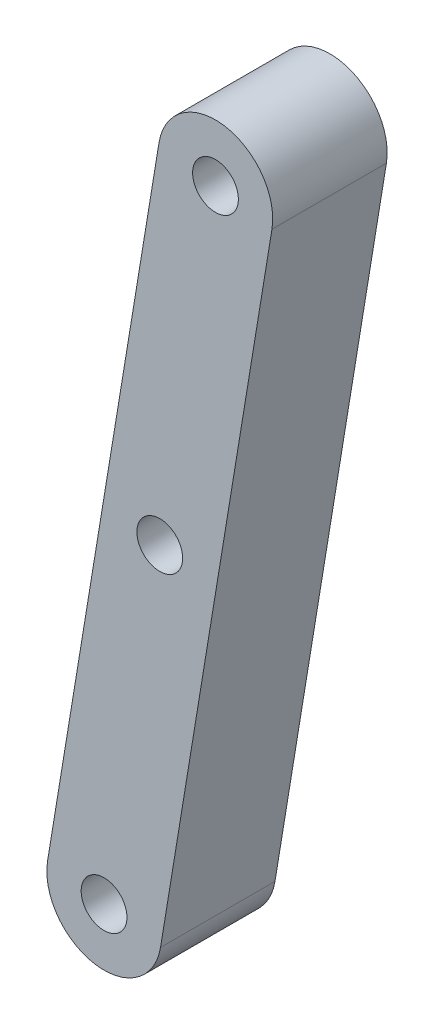
ISO-10303-21;
HEADER;
FILE_DESCRIPTION(('STEP AP214'),'2;1');
FILE_NAME('part.step','',(''),(''),'','','');
FILE_SCHEMA(('AUTOMOTIVE_DESIGN { 1 0 10303 214 1 1 1 1 }'));
ENDSEC;
DATA;
#1=APPLICATION_CONTEXT('core data for automotive mechanical design processes');
#2=APPLICATION_PROTOCOL_DEFINITION('international standard','automotive_design',2000,#1);
#3=PRODUCT_CONTEXT('',#1,'mechanical');
#4=PRODUCT('Part','Part','',(#3));
#5=PRODUCT_RELATED_PRODUCT_CATEGORY('part','',(#4));
#6=PRODUCT_DEFINITION_FORMATION('','',#4);
#7=PRODUCT_DEFINITION_CONTEXT('part definition',#1,'design');
#8=PRODUCT_DEFINITION('design','',#6,#7);
#9=PRODUCT_DEFINITION_SHAPE('','',#8);
#10=(LENGTH_UNIT() NAMED_UNIT(*) SI_UNIT(.MILLI.,.METRE.));
#11=(NAMED_UNIT(*) PLANE_ANGLE_UNIT() SI_UNIT($,.RADIAN.));
#12=(NAMED_UNIT(*) SI_UNIT($,.STERADIAN.) SOLID_ANGLE_UNIT());
#13=UNCERTAINTY_MEASURE_WITH_UNIT(LENGTH_MEASURE(1.E-05),#10,'distance_accuracy_value','');
#14=(GEOMETRIC_REPRESENTATION_CONTEXT(3) GLOBAL_UNCERTAINTY_ASSIGNED_CONTEXT((#13)) GLOBAL_UNIT_ASSIGNED_CONTEXT((#10,
#11,#12)) REPRESENTATION_CONTEXT('',''));
#15=CARTESIAN_POINT('',(0.,0.,0.));
#16=DIRECTION('',(0.,0.,1.));
#17=DIRECTION('',(1.,0.,0.));
#18=AXIS2_PLACEMENT_3D('',#15,#16,#17);
#19=CARTESIAN_POINT('',(-0.265703813634478,19.205096721111,10.));
#20=DIRECTION('',(0.,0.,1.));
#21=DIRECTION('',(1.,0.,0.));
#22=AXIS2_PLACEMENT_3D('',#19,#20,#21);
#23=PLANE('',#22);
#24=CARTESIAN_POINT('',(-5.13285190681724,-10.3974516394445,10.));
#25=DIRECTION('',(0.,0.,1.));
#26=DIRECTION('',(1.,0.,0.));
#27=AXIS2_PLACEMENT_3D('',#24,#25,#26);
#28=CIRCLE('',#27,2.);
#29=CARTESIAN_POINT('',(-3.13285190681724,-10.3974516394445,10.));
#30=VERTEX_POINT('',#29);
#31=EDGE_CURVE('E118',#30,#30,#28,.T.);
#32=ORIENTED_EDGE('',*,*,#31,.F.);
#33=EDGE_LOOP('',(#32));
#34=FACE_BOUND('',#33,.T.);
#35=CARTESIAN_POINT('',(-0.265703813634478,19.205096721111,10.));
#36=DIRECTION('',(0.,0.,1.));
#37=DIRECTION('',(1.,0.,0.));
#38=AXIS2_PLACEMENT_3D('',#35,#36,#37);
#39=CIRCLE('',#38,5.);
#40=CARTESIAN_POINT('',(4.66805424645811,18.3939053722472,10.));
#41=VERTEX_POINT('',#40);
#42=CARTESIAN_POINT('',(-5.19946187372706,20.0162880699748,10.));
#43=VERTEX_POINT('',#42);
#44=EDGE_CURVE('E88',#41,#43,#39,.T.);
#45=ORIENTED_EDGE('',*,*,#44,.T.);
#46=DIRECTION('',(-0.162238269772759,-0.986751612018517,0.));
#47=VECTOR('',#46,1.);
#48=CARTESIAN_POINT('',(-5.19946187372706,20.0162880699748,10.));
#49=LINE('',#48,#47);
#50=CARTESIAN_POINT('',(-14.9337580600926,-39.1888086511362,10.));
#51=VERTEX_POINT('',#50);
#52=EDGE_CURVE('E83',#43,#51,#49,.T.);
#53=ORIENTED_EDGE('',*,*,#52,.T.);
#54=CARTESIAN_POINT('',(-10.,-40.,10.));
#55=DIRECTION('',(0.,0.,1.));
#56=DIRECTION('',(1.,0.,0.));
#57=AXIS2_PLACEMENT_3D('',#54,#55,#56);
#58=CIRCLE('',#57,5.);
#59=CARTESIAN_POINT('',(-5.06624193990742,-40.8111913488638,10.));
#60=VERTEX_POINT('',#59);
#61=EDGE_CURVE('E86',#51,#60,#58,.T.);
#62=ORIENTED_EDGE('',*,*,#61,.T.);
#63=DIRECTION('',(0.162238269772759,0.986751612018517,0.));
#64=VECTOR('',#63,1.);
#65=CARTESIAN_POINT('',(-5.06624193990742,-40.8111913488638,10.));
#66=LINE('',#65,#64);
#67=EDGE_CURVE('E53',#60,#41,#66,.T.);
#68=ORIENTED_EDGE('',*,*,#67,.T.);
#69=EDGE_LOOP('',(#45,#53,#62,#68));
#70=FACE_BOUND('',#69,.T.);
#71=CARTESIAN_POINT('',(-10.,-40.,10.));
#72=DIRECTION('',(0.,0.,1.));
#73=DIRECTION('',(1.,0.,0.));
#74=AXIS2_PLACEMENT_3D('',#71,#72,#73);
#75=CIRCLE('',#74,2.);
#76=CARTESIAN_POINT('',(-8.,-40.,10.));
#77=VERTEX_POINT('',#76);
#78=EDGE_CURVE('E103',#77,#77,#75,.T.);
#79=ORIENTED_EDGE('',*,*,#78,.F.);
#80=EDGE_LOOP('',(#79));
#81=FACE_BOUND('',#80,.T.);
#82=CARTESIAN_POINT('',(-0.265703813634478,19.205096721111,10.));
#83=DIRECTION('',(0.,0.,1.));
#84=DIRECTION('',(1.,0.,0.));
#85=AXIS2_PLACEMENT_3D('',#82,#83,#84);
#86=CIRCLE('',#85,2.);
#87=CARTESIAN_POINT('',(1.73429618636552,19.205096721111,10.));
#88=VERTEX_POINT('',#87);
#89=EDGE_CURVE('E124',#88,#88,#86,.T.);
#90=ORIENTED_EDGE('',*,*,#89,.F.);
#91=EDGE_LOOP('',(#90));
#92=FACE_BOUND('',#91,.T.);
#93=ADVANCED_FACE('F36',(#34,#70,#81,#92),#23,.T.);
#94=CARTESIAN_POINT('',(-0.265703813634478,19.205096721111,0.));
#95=DIRECTION('',(0.,0.,1.));
#96=DIRECTION('',(1.,0.,0.));
#97=AXIS2_PLACEMENT_3D('',#94,#95,#96);
#98=PLANE('',#97);
#99=CARTESIAN_POINT('',(-0.265703813634478,19.205096721111,0.));
#100=DIRECTION('',(0.,0.,1.));
#101=DIRECTION('',(1.,0.,0.));
#102=AXIS2_PLACEMENT_3D('',#99,#100,#101);
#103=CIRCLE('',#102,5.);
#104=CARTESIAN_POINT('',(4.66805424645811,18.3939053722472,0.));
#105=VERTEX_POINT('',#104);
#106=CARTESIAN_POINT('',(-5.19946187372706,20.0162880699748,0.));
#107=VERTEX_POINT('',#106);
#108=EDGE_CURVE('E100',#105,#107,#103,.T.);
#109=ORIENTED_EDGE('',*,*,#108,.F.);
#110=DIRECTION('',(0.162238269772759,0.986751612018517,0.));
#111=VECTOR('',#110,1.);
#112=CARTESIAN_POINT('',(-5.06624193990742,-40.8111913488638,0.));
#113=LINE('',#112,#111);
#114=CARTESIAN_POINT('',(-5.06624193990742,-40.8111913488638,0.));
#115=VERTEX_POINT('',#114);
#116=EDGE_CURVE('E76',#115,#105,#113,.T.);
#117=ORIENTED_EDGE('',*,*,#116,.F.);
#118=CARTESIAN_POINT('',(-10.,-40.,0.));
#119=DIRECTION('',(0.,0.,1.));
#120=DIRECTION('',(1.,0.,0.));
#121=AXIS2_PLACEMENT_3D('',#118,#119,#120);
#122=CIRCLE('',#121,5.);
#123=CARTESIAN_POINT('',(-14.9337580600926,-39.1888086511362,0.));
#124=VERTEX_POINT('',#123);
#125=EDGE_CURVE('E70',#124,#115,#122,.T.);
#126=ORIENTED_EDGE('',*,*,#125,.F.);
#127=DIRECTION('',(-0.162238269772759,-0.986751612018517,0.));
#128=VECTOR('',#127,1.);
#129=CARTESIAN_POINT('',(-5.19946187372706,20.0162880699748,0.));
#130=LINE('',#129,#128);
#131=EDGE_CURVE('E92',#107,#124,#130,.T.);
#132=ORIENTED_EDGE('',*,*,#131,.F.);
#133=EDGE_LOOP('',(#109,#117,#126,#132));
#134=FACE_BOUND('',#133,.T.);
#135=CARTESIAN_POINT('',(-10.,-40.,0.));
#136=DIRECTION('',(0.,0.,1.));
#137=DIRECTION('',(1.,0.,0.));
#138=AXIS2_PLACEMENT_3D('',#135,#136,#137);
#139=CIRCLE('',#138,2.);
#140=CARTESIAN_POINT('',(-8.,-40.,0.));
#141=VERTEX_POINT('',#140);
#142=EDGE_CURVE('E115',#141,#141,#139,.T.);
#143=ORIENTED_EDGE('',*,*,#142,.T.);
#144=EDGE_LOOP('',(#143));
#145=FACE_BOUND('',#144,.T.);
#146=CARTESIAN_POINT('',(-5.13285190681724,-10.3974516394445,0.));
#147=DIRECTION('',(0.,0.,1.));
#148=DIRECTION('',(1.,0.,0.));
#149=AXIS2_PLACEMENT_3D('',#146,#147,#148);
#150=CIRCLE('',#149,2.);
#151=CARTESIAN_POINT('',(-3.13285190681724,-10.3974516394445,0.));
#152=VERTEX_POINT('',#151);
#153=EDGE_CURVE('E121',#152,#152,#150,.T.);
#154=ORIENTED_EDGE('',*,*,#153,.T.);
#155=EDGE_LOOP('',(#154));
#156=FACE_BOUND('',#155,.T.);
#157=CARTESIAN_POINT('',(-0.265703813634478,19.205096721111,0.));
#158=DIRECTION('',(0.,0.,1.));
#159=DIRECTION('',(1.,0.,0.));
#160=AXIS2_PLACEMENT_3D('',#157,#158,#159);
#161=CIRCLE('',#160,2.);
#162=CARTESIAN_POINT('',(1.73429618636552,19.205096721111,0.));
#163=VERTEX_POINT('',#162);
#164=EDGE_CURVE('E127',#163,#163,#161,.T.);
#165=ORIENTED_EDGE('',*,*,#164,.T.);
#166=EDGE_LOOP('',(#165));
#167=FACE_BOUND('',#166,.T.);
#168=ADVANCED_FACE('F111',(#134,#145,#156,#167),#98,.F.);
#169=CARTESIAN_POINT('',(-0.265703813634478,19.205096721111,10.));
#170=DIRECTION('',(0.,0.,-1.));
#171=DIRECTION('',(-1.,0.,0.));
#172=AXIS2_PLACEMENT_3D('',#169,#170,#171);
#173=CYLINDRICAL_SURFACE('',#172,5.);
#174=ORIENTED_EDGE('',*,*,#108,.T.);
#175=DIRECTION('',(0.,0.,-1.));
#176=VECTOR('',#175,1.);
#177=CARTESIAN_POINT('',(-5.19946187372706,20.0162880699748,10.));
#178=LINE('',#177,#176);
#179=EDGE_CURVE('E11',#43,#107,#178,.T.);
#180=ORIENTED_EDGE('',*,*,#179,.F.);
#181=ORIENTED_EDGE('',*,*,#44,.F.);
#182=DIRECTION('',(0.,0.,-1.));
#183=VECTOR('',#182,1.);
#184=CARTESIAN_POINT('',(4.66805424645811,18.3939053722472,10.));
#185=LINE('',#184,#183);
#186=EDGE_CURVE('E96',#41,#105,#185,.T.);
#187=ORIENTED_EDGE('',*,*,#186,.T.);
#188=EDGE_LOOP('',(#174,#180,#181,#187));
#189=FACE_BOUND('',#188,.T.);
#190=ADVANCED_FACE('F38',(#189),#173,.T.);
#191=CARTESIAN_POINT('',(-5.19946187372706,20.0162880699748,10.));
#192=DIRECTION('',(0.986751612018517,-0.162238269772759,0.));
#193=DIRECTION('',(0.162238269772759,0.986751612018517,0.));
#194=AXIS2_PLACEMENT_3D('',#191,#192,#193);
#195=PLANE('',#194);
#196=ORIENTED_EDGE('',*,*,#131,.T.);
#197=DIRECTION('',(0.,0.,-1.));
#198=VECTOR('',#197,1.);
#199=CARTESIAN_POINT('',(-14.9337580600926,-39.1888086511362,10.));
#200=LINE('',#199,#198);
#201=EDGE_CURVE('E45',#51,#124,#200,.T.);
#202=ORIENTED_EDGE('',*,*,#201,.F.);
#203=ORIENTED_EDGE('',*,*,#52,.F.);
#204=ORIENTED_EDGE('',*,*,#179,.T.);
#205=EDGE_LOOP('',(#196,#202,#203,#204));
#206=FACE_BOUND('',#205,.T.);
#207=ADVANCED_FACE('F91',(#206),#195,.F.);
#208=CARTESIAN_POINT('',(-10.,-40.,10.));
#209=DIRECTION('',(0.,0.,-1.));
#210=DIRECTION('',(-1.,0.,0.));
#211=AXIS2_PLACEMENT_3D('',#208,#209,#210);
#212=CYLINDRICAL_SURFACE('',#211,5.);
#213=ORIENTED_EDGE('',*,*,#125,.T.);
#214=DIRECTION('',(0.,0.,-1.));
#215=VECTOR('',#214,1.);
#216=CARTESIAN_POINT('',(-5.06624193990742,-40.8111913488638,10.));
#217=LINE('',#216,#215);
#218=EDGE_CURVE('E93',#60,#115,#217,.T.);
#219=ORIENTED_EDGE('',*,*,#218,.F.);
#220=ORIENTED_EDGE('',*,*,#61,.F.);
#221=ORIENTED_EDGE('',*,*,#201,.T.);
#222=EDGE_LOOP('',(#213,#219,#220,#221));
#223=FACE_BOUND('',#222,.T.);
#224=ADVANCED_FACE('F94',(#223),#212,.T.);
#225=CARTESIAN_POINT('',(-5.06624193990742,-40.8111913488638,10.));
#226=DIRECTION('',(-0.986751612018517,0.162238269772759,0.));
#227=DIRECTION('',(-0.162238269772759,-0.986751612018517,0.));
#228=AXIS2_PLACEMENT_3D('',#225,#226,#227);
#229=PLANE('',#228);
#230=ORIENTED_EDGE('',*,*,#116,.T.);
#231=ORIENTED_EDGE('',*,*,#186,.F.);
#232=ORIENTED_EDGE('',*,*,#67,.F.);
#233=ORIENTED_EDGE('',*,*,#218,.T.);
#234=EDGE_LOOP('',(#230,#231,#232,#233));
#235=FACE_BOUND('',#234,.T.);
#236=ADVANCED_FACE('F108',(#235),#229,.F.);
#237=CARTESIAN_POINT('',(-10.,-40.,10.));
#238=DIRECTION('',(0.,0.,-1.));
#239=DIRECTION('',(-1.,0.,0.));
#240=AXIS2_PLACEMENT_3D('',#237,#238,#239);
#241=CYLINDRICAL_SURFACE('',#240,2.);
#242=ORIENTED_EDGE('',*,*,#78,.T.);
#243=EDGE_LOOP('',(#242));
#244=FACE_BOUND('',#243,.T.);
#245=ORIENTED_EDGE('',*,*,#142,.F.);
#246=EDGE_LOOP('',(#245));
#247=FACE_BOUND('',#246,.T.);
#248=ADVANCED_FACE('F145',(#244,#247),#241,.F.);
#249=CARTESIAN_POINT('',(-5.13285190681724,-10.3974516394445,10.));
#250=DIRECTION('',(0.,0.,-1.));
#251=DIRECTION('',(-1.,0.,0.));
#252=AXIS2_PLACEMENT_3D('',#249,#250,#251);
#253=CYLINDRICAL_SURFACE('',#252,2.);
#254=ORIENTED_EDGE('',*,*,#31,.T.);
#255=EDGE_LOOP('',(#254));
#256=FACE_BOUND('',#255,.T.);
#257=ORIENTED_EDGE('',*,*,#153,.F.);
#258=EDGE_LOOP('',(#257));
#259=FACE_BOUND('',#258,.T.);
#260=ADVANCED_FACE('F191',(#256,#259),#253,.F.);
#261=CARTESIAN_POINT('',(-0.265703813634478,19.205096721111,10.));
#262=DIRECTION('',(0.,0.,-1.));
#263=DIRECTION('',(-1.,0.,0.));
#264=AXIS2_PLACEMENT_3D('',#261,#262,#263);
#265=CYLINDRICAL_SURFACE('',#264,2.);
#266=ORIENTED_EDGE('',*,*,#89,.T.);
#267=EDGE_LOOP('',(#266));
#268=FACE_BOUND('',#267,.T.);
#269=ORIENTED_EDGE('',*,*,#164,.F.);
#270=EDGE_LOOP('',(#269));
#271=FACE_BOUND('',#270,.T.);
#272=ADVANCED_FACE('F133',(#268,#271),#265,.F.);
#273=CLOSED_SHELL('',(#93,#168,#190,#207,#224,#236,#248,#260,#272));
#274=MANIFOLD_SOLID_BREP('B2',#273);
#275=ADVANCED_BREP_SHAPE_REPRESENTATION('',(#18,#274),#14);
#276=SHAPE_DEFINITION_REPRESENTATION(#9,#275);
ENDSEC;
END-ISO-10303-21;
